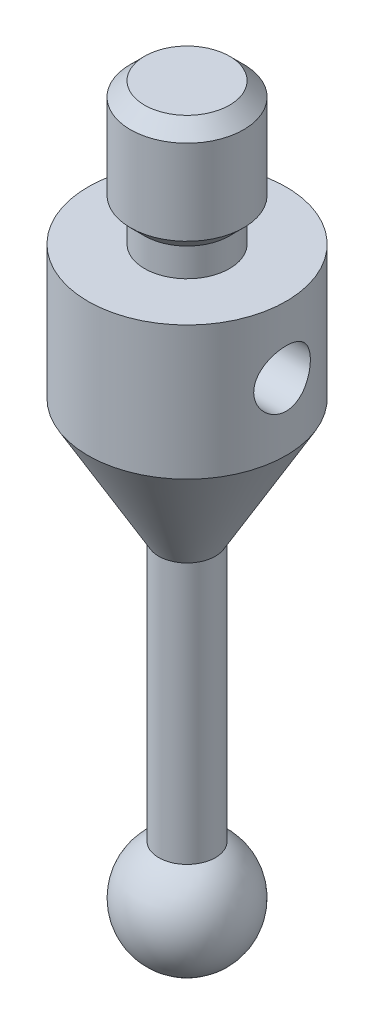
ISO-10303-21;
HEADER;
FILE_DESCRIPTION(('STEP AP214'),'2;1');
FILE_NAME('part.step','',(''),(''),'','','');
FILE_SCHEMA(('AUTOMOTIVE_DESIGN { 1 0 10303 214 1 1 1 1 }'));
ENDSEC;
DATA;
#1=APPLICATION_CONTEXT('core data for automotive mechanical design processes');
#2=APPLICATION_PROTOCOL_DEFINITION('international standard','automotive_design',2000,#1);
#3=PRODUCT_CONTEXT('',#1,'mechanical');
#4=PRODUCT('Part','Part','',(#3));
#5=PRODUCT_RELATED_PRODUCT_CATEGORY('part','',(#4));
#6=PRODUCT_DEFINITION_FORMATION('','',#4);
#7=PRODUCT_DEFINITION_CONTEXT('part definition',#1,'design');
#8=PRODUCT_DEFINITION('design','',#6,#7);
#9=PRODUCT_DEFINITION_SHAPE('','',#8);
#10=(LENGTH_UNIT() NAMED_UNIT(*) SI_UNIT(.MILLI.,.METRE.));
#11=(NAMED_UNIT(*) PLANE_ANGLE_UNIT() SI_UNIT($,.RADIAN.));
#12=(NAMED_UNIT(*) SI_UNIT($,.STERADIAN.) SOLID_ANGLE_UNIT());
#13=UNCERTAINTY_MEASURE_WITH_UNIT(LENGTH_MEASURE(1.E-05),#10,'distance_accuracy_value','');
#14=(GEOMETRIC_REPRESENTATION_CONTEXT(3) GLOBAL_UNCERTAINTY_ASSIGNED_CONTEXT((#13)) GLOBAL_UNIT_ASSIGNED_CONTEXT((#10,
#11,#12)) REPRESENTATION_CONTEXT('',''));
#15=CARTESIAN_POINT('',(0.,0.,0.));
#16=DIRECTION('',(0.,0.,1.));
#17=DIRECTION('',(1.,0.,0.));
#18=AXIS2_PLACEMENT_3D('',#15,#16,#17);
#19=CARTESIAN_POINT('',(0.,10.,0.));
#20=DIRECTION('',(0.,-1.,0.));
#21=DIRECTION('',(0.,0.,-1.));
#22=AXIS2_PLACEMENT_3D('',#19,#20,#21);
#23=CYLINDRICAL_SURFACE('',#22,1.);
#24=CARTESIAN_POINT('',(0.,10.952627944163,0.));
#25=DIRECTION('',(0.,1.,0.));
#26=DIRECTION('',(0.,0.,1.));
#27=AXIS2_PLACEMENT_3D('',#24,#25,#26);
#28=CIRCLE('',#27,1.);
#29=CARTESIAN_POINT('',(0.,10.952627944163,0.999999999999999));
#30=VERTEX_POINT('',#29);
#31=EDGE_CURVE('E151',#30,#30,#28,.F.);
#32=ORIENTED_EDGE('',*,*,#31,.T.);
#33=EDGE_LOOP('',(#32));
#34=FACE_BOUND('',#33,.T.);
#35=CARTESIAN_POINT('',(0.,1.73205080756888,0.));
#36=DIRECTION('',(0.,-1.,0.));
#37=DIRECTION('',(0.,0.,-1.));
#38=AXIS2_PLACEMENT_3D('',#35,#36,#37);
#39=CIRCLE('',#38,1.);
#40=CARTESIAN_POINT('',(0.,1.73205080756888,-1.));
#41=VERTEX_POINT('',#40);
#42=EDGE_CURVE('E146',#41,#41,#39,.T.);
#43=ORIENTED_EDGE('',*,*,#42,.F.);
#44=EDGE_LOOP('',(#43));
#45=FACE_BOUND('',#44,.T.);
#46=ADVANCED_FACE('F39',(#34,#45),#23,.T.);
#47=CARTESIAN_POINT('',(0.,0.,0.));
#48=DIRECTION('',(0.,-1.,0.));
#49=DIRECTION('',(1.,0.,0.));
#50=AXIS2_PLACEMENT_3D('',#47,#48,#49);
#51=SPHERICAL_SURFACE('',#50,2.);
#52=ORIENTED_EDGE('',*,*,#42,.T.);
#53=EDGE_LOOP('',(#52));
#54=FACE_BOUND('',#53,.T.);
#55=ADVANCED_FACE('F93',(#54),#51,.T.);
#56=CARTESIAN_POINT('',(0.,20.,0.));
#57=DIRECTION('',(0.,-1.,0.));
#58=DIRECTION('',(0.,0.,-1.));
#59=AXIS2_PLACEMENT_3D('',#56,#57,#58);
#60=CYLINDRICAL_SURFACE('',#59,3.5);
#61=CARTESIAN_POINT('',(-3.5,16.6413774815425,0.));
#62=CARTESIAN_POINT('',(-3.49999934647171,16.6413784513235,-0.0549774511886255));
#63=CARTESIAN_POINT('',(-3.49869208701023,16.6459263760306,-0.109964873936291));
#64=CARTESIAN_POINT('',(-3.49360452972549,16.6639596165937,-0.218345995598494));
#65=CARTESIAN_POINT('',(-3.48982329605034,16.6774483145796,-0.271739083414808));
#66=CARTESIAN_POINT('',(-3.48020345674544,16.7128815007508,-0.375352150368936));
#67=CARTESIAN_POINT('',(-3.474367720532,16.7348141996185,-0.425576440424113));
#68=CARTESIAN_POINT('',(-3.46124989158242,16.7864664772817,-0.521634380564634));
#69=CARTESIAN_POINT('',(-3.45396764753901,16.8161868707877,-0.567467570589078));
#70=CARTESIAN_POINT('',(-3.43852367312902,16.883394986879,-0.654647223429479));
#71=CARTESIAN_POINT('',(-3.4303452097302,16.9210498584703,-0.695861861190491));
#72=CARTESIAN_POINT('',(-3.41413367457396,17.0027013531112,-0.771485678962156));
#73=CARTESIAN_POINT('',(-3.40610062478085,17.0466989253581,-0.805893838538839));
#74=CARTESIAN_POINT('',(-3.39091507439313,17.1408742729386,-0.867598950032229));
#75=CARTESIAN_POINT('',(-3.38378351259108,17.1911584740771,-0.894739105517031));
#76=CARTESIAN_POINT('',(-3.37145671914235,17.2958134874158,-0.940125852769618));
#77=CARTESIAN_POINT('',(-3.36626107099664,17.3501834175701,-0.958374357777525));
#78=CARTESIAN_POINT('',(-3.35856804120241,17.4599948631266,-0.984992165068877));
#79=CARTESIAN_POINT('',(-3.35600489366891,17.5153731629416,-0.993602766016076));
#80=CARTESIAN_POINT('',(-3.35367104182518,17.6268430557842,-1.00145333894795));
#81=CARTESIAN_POINT('',(-3.35389973075333,17.6829344911757,-1.00069534704803));
#82=CARTESIAN_POINT('',(-3.35706517184156,17.7923117872693,-0.990020673813954));
#83=CARTESIAN_POINT('',(-3.35991391343389,17.8456296571326,-0.980401628641807));
#84=CARTESIAN_POINT('',(-3.36785674196985,17.9498610913567,-0.952756930429099));
#85=CARTESIAN_POINT('',(-3.37295103189705,18.0007744379029,-0.934730517406291));
#86=CARTESIAN_POINT('',(-3.38488431756517,18.0995006037583,-0.890553405689021));
#87=CARTESIAN_POINT('',(-3.39174458202416,18.1472660177433,-0.864302755864396));
#88=CARTESIAN_POINT('',(-3.40642608441438,18.2378157621493,-0.804491895839434));
#89=CARTESIAN_POINT('',(-3.41424753611068,18.28059898041,-0.770930058366727));
#90=CARTESIAN_POINT('',(-3.43033125328062,18.3616636693457,-0.695951998365102));
#91=CARTESIAN_POINT('',(-3.43859902286152,18.3997147195261,-0.654287437422663));
#92=CARTESIAN_POINT('',(-3.45438123609203,18.4683404833627,-0.565066141193114));
#93=CARTESIAN_POINT('',(-3.46189564068921,18.4989148095634,-0.517509100740947));
#94=CARTESIAN_POINT('',(-3.47538264032742,18.5518418489296,-0.417461536545724));
#95=CARTESIAN_POINT('',(-3.48134637748612,18.5741476249446,-0.364944908905003));
#96=CARTESIAN_POINT('',(-3.49099625743795,18.6095444272509,-0.256696614983735));
#97=CARTESIAN_POINT('',(-3.49468297428128,18.6226377761652,-0.200965762905073));
#98=CARTESIAN_POINT('',(-3.49927437257336,18.6388641243973,-0.0898331943221744));
#99=CARTESIAN_POINT('',(-3.50026636425301,18.642309829229,-0.0344806734302534));
#100=CARTESIAN_POINT('',(-3.49961042353544,18.640013848392,0.076013263402791));
#101=CARTESIAN_POINT('',(-3.49796280790308,18.6342732651196,0.131154703878552));
#102=CARTESIAN_POINT('',(-3.49226963342609,18.6140222593844,0.238509316715159));
#103=CARTESIAN_POINT('',(-3.48827306508862,18.5996908908808,0.290759105867427));
#104=CARTESIAN_POINT('',(-3.4783399937092,18.5628772305502,0.392104343102815));
#105=CARTESIAN_POINT('',(-3.47240326632854,18.5403939960979,0.441199425624337));
#106=CARTESIAN_POINT('',(-3.45904980584657,18.4873658132199,0.536020842560038));
#107=CARTESIAN_POINT('',(-3.45160381589487,18.4566568821296,0.581651243270128));
#108=CARTESIAN_POINT('',(-3.43608973548903,18.3882512285672,0.667219264029655));
#109=CARTESIAN_POINT('',(-3.42802150376367,18.3505529165111,0.707155585421215));
#110=CARTESIAN_POINT('',(-3.41184309815947,18.2677728105169,0.781553214170353));
#111=CARTESIAN_POINT('',(-3.40374018433795,18.2224898437597,0.815792713704769));
#112=CARTESIAN_POINT('',(-3.38869447362751,18.1266461872335,0.87619765803258));
#113=CARTESIAN_POINT('',(-3.3817516363796,18.0760856811693,0.902363383738854));
#114=CARTESIAN_POINT('',(-3.36989325638715,17.9713318760467,0.945687270594172));
#115=CARTESIAN_POINT('',(-3.36496700079018,17.9171595997562,0.962893166212217));
#116=CARTESIAN_POINT('',(-3.35771228398834,17.8065225137153,0.987897250353705));
#117=CARTESIAN_POINT('',(-3.35538303564047,17.7500584039915,0.995698289511612));
#118=CARTESIAN_POINT('',(-3.35365851547575,17.6387294650818,1.00149012123096));
#119=CARTESIAN_POINT('',(-3.35415580399703,17.5838847292662,0.999840138221142));
#120=CARTESIAN_POINT('',(-3.35777298607399,17.4752901162096,0.987623554788216));
#121=CARTESIAN_POINT('',(-3.36089279211716,17.421540202496,0.977057251899603));
#122=CARTESIAN_POINT('',(-3.36933488579116,17.3171882959588,0.947529844083143));
#123=CARTESIAN_POINT('',(-3.37463438524179,17.2665597880371,0.928655458931764));
#124=CARTESIAN_POINT('',(-3.38683651421364,17.1691481142963,0.883114746507969));
#125=CARTESIAN_POINT('',(-3.3937394274128,17.1223656309059,0.856447040215779));
#126=CARTESIAN_POINT('',(-3.40865834474881,17.0322857206399,0.795032732674125));
#127=CARTESIAN_POINT('',(-3.41670381589509,16.9891567858716,0.760046138613655));
#128=CARTESIAN_POINT('',(-3.43284922546139,16.9092655336376,0.683429920189677));
#129=CARTESIAN_POINT('',(-3.4409491770859,16.8725048219871,0.64179862536428));
#130=CARTESIAN_POINT('',(-3.45653979786176,16.8054588893792,0.551787160432696));
#131=CARTESIAN_POINT('',(-3.46400950518705,16.7753639879077,0.50326125117989));
#132=CARTESIAN_POINT('',(-3.47725697888987,16.7238045890315,0.401625264823331));
#133=CARTESIAN_POINT('',(-3.48303566935144,16.702335375576,0.34851771205737));
#134=CARTESIAN_POINT('',(-3.49163672362653,16.6709537058448,0.246458157667517));
#135=CARTESIAN_POINT('',(-3.49474842181038,16.6598907132003,0.197881503812195));
#136=CARTESIAN_POINT('',(-3.49893021926074,16.6451026529215,0.0995391843931838));
#137=CARTESIAN_POINT('',(-3.50000059166997,16.6413766035541,0.049773678808046));
#138=CARTESIAN_POINT('',(-3.5,16.6413774815425,0.));
#139=B_SPLINE_CURVE_WITH_KNOTS('',3,(#61,#62,#63,#64,#65,#66,#67,#68,#69,#70,#71,#72,#73,#74,
#75,#76,#77,#78,#79,#80,#81,#82,#83,#84,#85,#86,#87,#88,#89,#90,#91,#92,#93,#94,#95,#96,#97,#98,
#99,#100,#101,#102,#103,#104,#105,#106,#107,#108,#109,#110,#111,#112,#113,#114,#115,#116,#117,
#118,#119,#120,#121,#122,#123,#124,#125,#126,#127,#128,#129,#130,#131,#132,#133,#134,#135,#136,
#137,#138),.UNSPECIFIED.,.T.,.F.,(4,2,2,2,2,2,2,2,2,2,2,2,2,2,2,2,2,2,2,2,2,2,2,2,2,2,2,2,2,2,2,
2,2,2,2,2,2,2,4),(0.,0.164749656271172,0.32956166989759,0.494144406447671,0.65874436771758,
0.827239057653908,0.995758989368569,1.16766537650029,1.33953475772405,1.50699754929408,
1.67442394611628,1.83642392910678,1.99843855889074,2.16250401641616,2.32660602784683,
2.49689250297262,2.66718780073736,2.83843550548236,3.00964002003318,3.17522728845112,
3.34079468713336,3.50302570235771,3.66527548283776,3.83103762668237,3.99683751589905,
4.16806052438178,4.33927757478661,4.50957286677749,4.6798165288708,4.8436334080145,
5.00744482086203,5.16958548138846,5.33175484992002,5.49933828438395,5.6669639154745,
5.83888989478295,6.01072174610257,6.15989734012186,6.30905297207072),.UNSPECIFIED.);
#140=CARTESIAN_POINT('',(-3.5,16.6413774815425,0.));
#141=VERTEX_POINT('',#140);
#142=EDGE_CURVE('E58',#141,#141,#139,.T.);
#143=ORIENTED_EDGE('',*,*,#142,.T.);
#144=EDGE_LOOP('',(#143));
#145=FACE_BOUND('',#144,.T.);
#146=CARTESIAN_POINT('',(3.35410196624968,17.6413774815425,-1.));
#147=CARTESIAN_POINT('',(3.3541027352982,17.5864517126198,-0.999999010234619));
#148=CARTESIAN_POINT('',(3.35546589937234,17.5315159394628,-0.995459333009394));
#149=CARTESIAN_POINT('',(3.36075194701915,17.423241862155,-0.977461816962149));
#150=CARTESIAN_POINT('',(3.36467587174621,17.369904217001,-0.9640003506833));
#151=CARTESIAN_POINT('',(3.37460354734501,17.2664088810913,-0.928646716460411));
#152=CARTESIAN_POINT('',(3.38060407621639,17.2162464056298,-0.90676760325832));
#153=CARTESIAN_POINT('',(3.39400460555119,17.1202935757695,-0.855241820315742));
#154=CARTESIAN_POINT('',(3.40140477214508,17.0745037413546,-0.825594228332021));
#155=CARTESIAN_POINT('',(3.41700891605117,16.987281698884,-0.758462400490704));
#156=CARTESIAN_POINT('',(3.42522877981549,16.9459935804776,-0.720794605566171));
#157=CARTESIAN_POINT('',(3.44140982756535,16.8702260898909,-0.639085622734715));
#158=CARTESIAN_POINT('',(3.44937098116968,16.8357475149812,-0.595043689579839));
#159=CARTESIAN_POINT('',(3.46431666000611,16.7739631573657,-0.500823016078775));
#160=CARTESIAN_POINT('',(3.47128027250394,16.746802671667,-0.450545391880929));
#161=CARTESIAN_POINT('',(3.48326270242804,16.7013765943346,-0.345904237619826));
#162=CARTESIAN_POINT('',(3.48828189845443,16.6831092709224,-0.291541505437589));
#163=CARTESIAN_POINT('',(3.49569759650108,16.6564602509227,-0.181779287560588));
#164=CARTESIAN_POINT('',(3.49815913505649,16.6478329706902,-0.126443899064521));
#165=CARTESIAN_POINT('',(3.50041047829849,16.6399341146009,-0.0150600512109629));
#166=CARTESIAN_POINT('',(3.50020079369491,16.6406607503739,0.0409882697942736));
#167=CARTESIAN_POINT('',(3.49718003381653,16.6512806690015,0.15049009786761));
#168=CARTESIAN_POINT('',(3.49444435388027,16.6609082878615,0.203971773054472));
#169=CARTESIAN_POINT('',(3.48676943165067,16.6886250327747,0.308526111088808));
#170=CARTESIAN_POINT('',(3.48183005528105,16.7067146736736,0.359598627150254));
#171=CARTESIAN_POINT('',(3.47019515886062,16.7510321819484,0.458536916864462));
#172=CARTESIAN_POINT('',(3.46348102756093,16.7773468704467,0.506361521925387));
#173=CARTESIAN_POINT('',(3.44901384486994,16.8372997747415,0.597003621795242));
#174=CARTESIAN_POINT('',(3.44126056595877,16.8709395953758,0.639820016208004));
#175=CARTESIAN_POINT('',(3.42522841509913,16.9459803368518,0.720816324273877));
#176=CARTESIAN_POINT('',(3.41694064685079,16.9876121983451,0.758780788792453));
#177=CARTESIAN_POINT('',(3.4010148689311,17.0767350274655,0.827246507874877));
#178=CARTESIAN_POINT('',(3.39337691201241,17.1242264700169,0.857747156891287));
#179=CARTESIAN_POINT('',(3.37957587408658,17.2242429237916,0.910616679927255));
#180=CARTESIAN_POINT('',(3.37342505474766,17.2768050940688,0.932918688943925));
#181=CARTESIAN_POINT('',(3.36344272188227,17.3851540632944,0.968294757480381));
#182=CARTESIAN_POINT('',(3.35961053356452,17.4409399188709,0.981371502013291));
#183=CARTESIAN_POINT('',(3.35484557617748,17.5521176937044,0.997537085998827));
#184=CARTESIAN_POINT('',(3.35381855730447,17.607458390003,1.00095074078696));
#185=CARTESIAN_POINT('',(3.35452079870229,17.7179216395,0.998594983598455));
#186=CARTESIAN_POINT('',(3.35624971515342,17.7730442190498,0.992826717122485));
#187=CARTESIAN_POINT('',(3.36217715008271,17.8801980955578,0.972558907129289));
#188=CARTESIAN_POINT('',(3.3663182147774,17.9322712745511,0.958262310920607));
#189=CARTESIAN_POINT('',(3.37654531970352,18.0332784175404,0.921575809332241));
#190=CARTESIAN_POINT('',(3.38263164056921,18.0822119273651,0.899184736133867));
#191=CARTESIAN_POINT('',(3.3962509400331,18.1768885191512,0.846309825608092));
#192=CARTESIAN_POINT('',(3.40381598690189,18.2225227036437,0.815639458645651));
#193=CARTESIAN_POINT('',(3.41946863275287,18.3081156682641,0.747302318424216));
#194=CARTESIAN_POINT('',(3.42755634473907,18.3480732150486,0.709634028840688));
#195=CARTESIAN_POINT('',(3.44367363717939,18.4225671906866,0.626854004982778));
#196=CARTESIAN_POINT('',(3.45169203023043,18.4568749672519,0.581533855120275));
#197=CARTESIAN_POINT('',(3.46648988523027,18.5174003222339,0.485592653528774));
#198=CARTESIAN_POINT('',(3.47326941192714,18.5436183235037,0.434971879049092));
#199=CARTESIAN_POINT('',(3.48478252423195,18.5869696250557,0.330216636478082));
#200=CARTESIAN_POINT('',(3.48953154063622,18.6041716763356,0.276112399949817));
#201=CARTESIAN_POINT('',(3.49651669811944,18.6291908825126,0.165622824274961));
#202=CARTESIAN_POINT('',(3.4987534856151,18.6370104516332,0.109238075792719));
#203=CARTESIAN_POINT('',(3.50042667501642,18.6428731985414,-0.00208911897951403));
#204=CARTESIAN_POINT('',(3.49995851794498,18.6412495560839,-0.0570128155249779));
#205=CARTESIAN_POINT('',(3.49649534561067,18.6290583408374,-0.165772586211002));
#206=CARTESIAN_POINT('',(3.49350045135296,18.6184911963515,-0.219608712308766));
#207=CARTESIAN_POINT('',(3.48534400930059,18.5889118010531,-0.324202066519794));
#208=CARTESIAN_POINT('',(3.4802020702409,18.5699758920705,-0.374982516717526));
#209=CARTESIAN_POINT('',(3.46828547071724,18.5242644023998,-0.472673601380731));
#210=CARTESIAN_POINT('',(3.46151055750883,18.4974876079964,-0.519583635290341));
#211=CARTESIAN_POINT('',(3.44679477720104,18.4359288128301,-0.609716728176957));
#212=CARTESIAN_POINT('',(3.43882522893152,18.4009324381483,-0.65278866400354));
#213=CARTESIAN_POINT('',(3.42272032493228,18.3243229188156,-0.73256061115919));
#214=CARTESIAN_POINT('',(3.4145849239342,18.2827079460001,-0.769258856094888));
#215=CARTESIAN_POINT('',(3.39882018772077,18.1927290230449,-0.836204230145643));
#216=CARTESIAN_POINT('',(3.39120975884781,18.144216507791,-0.866256583618026));
#217=CARTESIAN_POINT('',(3.37764222665283,18.042616548885,-0.91773971809804));
#218=CARTESIAN_POINT('',(3.37168419857914,17.9895316859977,-0.93917532442409));
#219=CARTESIAN_POINT('',(3.36279229780033,17.8875506314268,-0.970492670062522));
#220=CARTESIAN_POINT('',(3.3595621942308,17.8390323074933,-0.981529499909266));
#221=CARTESIAN_POINT('',(3.35521684727178,17.7408044223646,-0.99628303521783));
#222=CARTESIAN_POINT('',(3.35410127012429,17.6910950504195,-1.00000089591333));
#223=CARTESIAN_POINT('',(3.35410196624968,17.6413774815425,-1.));
#224=B_SPLINE_CURVE_WITH_KNOTS('',3,(#146,#147,#148,#149,#150,#151,#152,#153,#154,#155,#156,
#157,#158,#159,#160,#161,#162,#163,#164,#165,#166,#167,#168,#169,#170,#171,#172,#173,#174,#175,
#176,#177,#178,#179,#180,#181,#182,#183,#184,#185,#186,#187,#188,#189,#190,#191,#192,#193,#194,
#195,#196,#197,#198,#199,#200,#201,#202,#203,#204,#205,#206,#207,#208,#209,#210,#211,#212,#213,
#214,#215,#216,#217,#218,#219,#220,#221,#222,#223),.UNSPECIFIED.,.T.,.F.,(4,2,2,2,2,2,2,2,2,2,2,
2,2,2,2,2,2,2,2,2,2,2,2,2,2,2,2,2,2,2,2,2,2,2,2,2,2,2,4),(0.,0.164594171159105,0.32925530476515,
0.493662091823938,0.65808840545939,0.826785835988799,0.995503006148135,1.16735741502495,
1.33917834504425,1.50651450509943,1.67381867271781,1.83628518817283,1.99876158968833,
2.16301451684818,2.3273034658799,2.49735806342072,2.66742645310452,2.83885260310575,
3.01022883892078,3.17577181660546,3.34129414341279,3.5030264482031,3.66478209600074,
3.83054003013244,3.99633392302106,4.16772694180382,4.33911100034378,4.50916842641099,
4.67918208530373,4.84323448834084,5.00727903537341,5.16985706186659,5.33246026763666,
5.4998988436474,5.66738374949711,5.83926806202707,6.01105598599879,6.16006644425301,
6.30905338065555),.UNSPECIFIED.);
#225=CARTESIAN_POINT('',(3.35410196624968,17.6413774815425,-1.));
#226=VERTEX_POINT('',#225);
#227=EDGE_CURVE('E66',#226,#226,#224,.T.);
#228=ORIENTED_EDGE('',*,*,#227,.T.);
#229=EDGE_LOOP('',(#228));
#230=FACE_BOUND('',#229,.T.);
#231=CARTESIAN_POINT('',(0.,15.2827549630852,0.));
#232=DIRECTION('',(0.,1.,0.));
#233=DIRECTION('',(0.,0.,1.));
#234=AXIS2_PLACEMENT_3D('',#231,#232,#233);
#235=CIRCLE('',#234,3.5);
#236=CARTESIAN_POINT('',(0.,15.2827549630852,3.5));
#237=VERTEX_POINT('',#236);
#238=EDGE_CURVE('E149',#237,#237,#235,.T.);
#239=ORIENTED_EDGE('',*,*,#238,.T.);
#240=EDGE_LOOP('',(#239));
#241=FACE_BOUND('',#240,.T.);
#242=CARTESIAN_POINT('',(0.,20.,0.));
#243=DIRECTION('',(0.,1.,0.));
#244=DIRECTION('',(0.,0.,1.));
#245=AXIS2_PLACEMENT_3D('',#242,#243,#244);
#246=CIRCLE('',#245,3.5);
#247=CARTESIAN_POINT('',(0.,20.,3.5));
#248=VERTEX_POINT('',#247);
#249=EDGE_CURVE('E143',#248,#248,#246,.T.);
#250=ORIENTED_EDGE('',*,*,#249,.F.);
#251=EDGE_LOOP('',(#250));
#252=FACE_BOUND('',#251,.T.);
#253=ADVANCED_FACE('F71',(#145,#230,#241,#252),#60,.T.);
#254=CARTESIAN_POINT('',(0.,20.,0.));
#255=DIRECTION('',(0.,1.,0.));
#256=DIRECTION('',(0.,0.,1.));
#257=AXIS2_PLACEMENT_3D('',#254,#255,#256);
#258=PLANE('',#257);
#259=CARTESIAN_POINT('',(0.,20.,0.));
#260=DIRECTION('',(0.,1.,0.));
#261=DIRECTION('',(0.,0.,1.));
#262=AXIS2_PLACEMENT_3D('',#259,#260,#261);
#263=CIRCLE('',#262,1.5);
#264=CARTESIAN_POINT('',(0.,20.,1.5));
#265=VERTEX_POINT('',#264);
#266=EDGE_CURVE('E55',#265,#265,#263,.T.);
#267=ORIENTED_EDGE('',*,*,#266,.F.);
#268=EDGE_LOOP('',(#267));
#269=FACE_BOUND('',#268,.T.);
#270=ORIENTED_EDGE('',*,*,#249,.T.);
#271=EDGE_LOOP('',(#270));
#272=FACE_BOUND('',#271,.T.);
#273=ADVANCED_FACE('F83',(#269,#272),#258,.T.);
#274=CARTESIAN_POINT('',(0.,15.2827549630852,0.));
#275=DIRECTION('',(0.,1.,0.));
#276=DIRECTION('',(0.,0.,1.));
#277=AXIS2_PLACEMENT_3D('',#274,#275,#276);
#278=CONICAL_SURFACE('',#277,3.5,0.523598775598295);
#279=CARTESIAN_POINT('',(0.,10.952627944163,0.999999999999999));
#280=CARTESIAN_POINT('',(0.,10.9977334339434,1.02604166666667));
#281=CARTESIAN_POINT('',(0.,11.0428389237238,1.05208333333333));
#282=CARTESIAN_POINT('',(0.,11.1330499032847,1.10416666666667));
#283=CARTESIAN_POINT('',(0.,11.1781553930652,1.13020833333333));
#284=CARTESIAN_POINT('',(0.,11.268366372626,1.18229166666667));
#285=CARTESIAN_POINT('',(0.,11.3134718624065,1.20833333333333));
#286=CARTESIAN_POINT('',(0.,11.4036828419674,1.26041666666667));
#287=CARTESIAN_POINT('',(0.,11.4487883317478,1.28645833333333));
#288=CARTESIAN_POINT('',(0.,11.5389993113087,1.33854166666667));
#289=CARTESIAN_POINT('',(0.,11.5841048010891,1.36458333333333));
#290=CARTESIAN_POINT('',(0.,11.67431578065,1.41666666666667));
#291=CARTESIAN_POINT('',(0.,11.7194212704304,1.44270833333333));
#292=CARTESIAN_POINT('',(0.,11.8096322499913,1.49479166666667));
#293=CARTESIAN_POINT('',(0.,11.8547377397718,1.52083333333333));
#294=CARTESIAN_POINT('',(0.,11.9449487193326,1.57291666666667));
#295=CARTESIAN_POINT('',(0.,11.9900542091131,1.59895833333333));
#296=CARTESIAN_POINT('',(0.,12.080265188674,1.65104166666667));
#297=CARTESIAN_POINT('',(0.,12.1253706784544,1.67708333333333));
#298=CARTESIAN_POINT('',(0.,12.2155816580153,1.72916666666667));
#299=CARTESIAN_POINT('',(0.,12.2606871477957,1.75520833333333));
#300=CARTESIAN_POINT('',(0.,12.3508981273566,1.80729166666667));
#301=CARTESIAN_POINT('',(0.,12.396003617137,1.83333333333333));
#302=CARTESIAN_POINT('',(0.,12.4862145966979,1.88541666666667));
#303=CARTESIAN_POINT('',(0.,12.5313200864784,1.91145833333333));
#304=CARTESIAN_POINT('',(0.,12.6215310660392,1.96354166666667));
#305=CARTESIAN_POINT('',(0.,12.6666365558197,1.98958333333333));
#306=CARTESIAN_POINT('',(0.,12.7568475353806,2.04166666666667));
#307=CARTESIAN_POINT('',(0.,12.801953025161,2.06770833333333));
#308=CARTESIAN_POINT('',(0.,12.8921640047219,2.11979166666667));
#309=CARTESIAN_POINT('',(0.,12.9372694945023,2.14583333333333));
#310=CARTESIAN_POINT('',(0.,13.0274804740632,2.19791666666667));
#311=CARTESIAN_POINT('',(0.,13.0725859638436,2.22395833333333));
#312=CARTESIAN_POINT('',(0.,13.1627969434045,2.27604166666667));
#313=CARTESIAN_POINT('',(0.,13.2079024331849,2.30208333333333));
#314=CARTESIAN_POINT('',(0.,13.2981134127458,2.35416666666667));
#315=CARTESIAN_POINT('',(0.,13.3432189025263,2.38020833333333));
#316=CARTESIAN_POINT('',(0.,13.4334298820872,2.43229166666667));
#317=CARTESIAN_POINT('',(0.,13.4785353718676,2.45833333333333));
#318=CARTESIAN_POINT('',(0.,13.5687463514285,2.51041666666667));
#319=CARTESIAN_POINT('',(0.,13.6138518412089,2.53645833333333));
#320=CARTESIAN_POINT('',(0.,13.7040628207698,2.58854166666667));
#321=CARTESIAN_POINT('',(0.,13.7491683105502,2.61458333333333));
#322=CARTESIAN_POINT('',(0.,13.8393792901111,2.66666666666667));
#323=CARTESIAN_POINT('',(0.,13.8844847798915,2.69270833333333));
#324=CARTESIAN_POINT('',(0.,13.9746957594524,2.74479166666667));
#325=CARTESIAN_POINT('',(0.,14.0198012492329,2.77083333333333));
#326=CARTESIAN_POINT('',(0.,14.1100122287937,2.82291666666667));
#327=CARTESIAN_POINT('',(0.,14.1551177185742,2.84895833333333));
#328=CARTESIAN_POINT('',(0.,14.2453286981351,2.90104166666667));
#329=CARTESIAN_POINT('',(0.,14.2904341879155,2.92708333333333));
#330=CARTESIAN_POINT('',(0.,14.3806451674764,2.97916666666667));
#331=CARTESIAN_POINT('',(0.,14.4257506572568,3.00520833333333));
#332=CARTESIAN_POINT('',(0.,14.5159616368177,3.05729166666667));
#333=CARTESIAN_POINT('',(0.,14.5610671265981,3.08333333333333));
#334=CARTESIAN_POINT('',(0.,14.651278106159,3.13541666666667));
#335=CARTESIAN_POINT('',(0.,14.6963835959395,3.16145833333333));
#336=CARTESIAN_POINT('',(0.,14.7865945755003,3.21354166666667));
#337=CARTESIAN_POINT('',(0.,14.8317000652808,3.23958333333333));
#338=CARTESIAN_POINT('',(0.,14.9219110448417,3.29166666666667));
#339=CARTESIAN_POINT('',(0.,14.9670165346221,3.31770833333333));
#340=CARTESIAN_POINT('',(0.,15.057227514183,3.36979166666667));
#341=CARTESIAN_POINT('',(0.,15.1023330039634,3.39583333333333));
#342=CARTESIAN_POINT('',(0.,15.1925439835243,3.44791666666667));
#343=CARTESIAN_POINT('',(0.,15.2376494733047,3.47395833333333));
#344=CARTESIAN_POINT('',(0.,15.2827549630852,3.5));
#345=B_SPLINE_CURVE_WITH_KNOTS('',3,(#279,#280,#281,#282,#283,#284,#285,#286,#287,#288,#289,
#290,#291,#292,#293,#294,#295,#296,#297,#298,#299,#300,#301,#302,#303,#304,#305,#306,#307,#308,
#309,#310,#311,#312,#313,#314,#315,#316,#317,#318,#319,#320,#321,#322,#323,#324,#325,#326,#327,
#328,#329,#330,#331,#332,#333,#334,#335,#336,#337,#338,#339,#340,#341,#342,#343,#344),
.UNSPECIFIED.,.F.,.F.,(4,2,2,2,2,2,2,2,2,2,2,2,2,2,2,2,2,2,2,2,2,2,2,2,2,2,2,2,2,2,2,2,4),(0.,
0.156250000000002,0.312500000000002,0.468750000000003,0.625000000000004,0.781250000000006,
0.937500000000006,1.09375000000001,1.25000000000001,1.40625000000001,1.56250000000001,
1.71875000000001,1.87500000000001,2.03125000000002,2.18750000000002,2.34375000000002,
2.50000000000002,2.65625000000002,2.81250000000002,2.96875000000002,3.12500000000002,
3.28125000000002,3.43750000000003,3.59375000000003,3.75000000000003,3.90625000000003,
4.06250000000003,4.21875000000003,4.37500000000003,4.53125000000003,4.68750000000004,
4.84375000000004,5.00000000000004),.UNSPECIFIED.);
#346=EDGE_CURVE('BSEAM80',#30,#237,#345,.T.);
#347=ORIENTED_EDGE('',*,*,#31,.F.);
#348=ORIENTED_EDGE('',*,*,#238,.F.);
#349=ORIENTED_EDGE('',*,*,#346,.T.);
#350=ORIENTED_EDGE('',*,*,#346,.F.);
#351=EDGE_LOOP('',(#347,#349,#348,#350));
#352=FACE_BOUND('',#351,.T.);
#353=ADVANCED_FACE('F80',(#352),#278,.T.);
#354=CARTESIAN_POINT('',(-3.5,17.6413774815425,0.));
#355=DIRECTION('',(1.,0.,0.));
#356=DIRECTION('',(0.,0.,-1.));
#357=AXIS2_PLACEMENT_3D('',#354,#355,#356);
#358=CYLINDRICAL_SURFACE('',#357,1.);
#359=ORIENTED_EDGE('',*,*,#227,.F.);
#360=EDGE_LOOP('',(#359));
#361=FACE_BOUND('',#360,.T.);
#362=ORIENTED_EDGE('',*,*,#142,.F.);
#363=EDGE_LOOP('',(#362));
#364=FACE_BOUND('',#363,.T.);
#365=ADVANCED_FACE('F75',(#361,#364),#358,.F.);
#366=CARTESIAN_POINT('',(0.,21.,0.));
#367=DIRECTION('',(0.,-1.,0.));
#368=DIRECTION('',(0.,0.,-1.));
#369=AXIS2_PLACEMENT_3D('',#366,#367,#368);
#370=CYLINDRICAL_SURFACE('',#369,1.5);
#371=CARTESIAN_POINT('',(0.,21.,0.));
#372=DIRECTION('',(0.,1.,0.));
#373=DIRECTION('',(0.,0.,1.));
#374=AXIS2_PLACEMENT_3D('',#371,#372,#373);
#375=CIRCLE('',#374,1.5);
#376=CARTESIAN_POINT('',(0.,21.,1.5));
#377=VERTEX_POINT('',#376);
#378=EDGE_CURVE('E138',#377,#377,#375,.T.);
#379=ORIENTED_EDGE('',*,*,#378,.F.);
#380=EDGE_LOOP('',(#379));
#381=FACE_BOUND('',#380,.T.);
#382=ORIENTED_EDGE('',*,*,#266,.T.);
#383=EDGE_LOOP('',(#382));
#384=FACE_BOUND('',#383,.T.);
#385=ADVANCED_FACE('F79',(#381,#384),#370,.T.);
#386=CARTESIAN_POINT('',(0.,25.,0.));
#387=DIRECTION('',(0.,-1.,0.));
#388=DIRECTION('',(0.,0.,-1.));
#389=AXIS2_PLACEMENT_3D('',#386,#387,#388);
#390=CYLINDRICAL_SURFACE('',#389,2.);
#391=CARTESIAN_POINT('',(0.,24.5,0.));
#392=DIRECTION('',(0.,1.,0.));
#393=DIRECTION('',(0.,0.,1.));
#394=AXIS2_PLACEMENT_3D('',#391,#392,#393);
#395=CIRCLE('',#394,2.);
#396=CARTESIAN_POINT('',(0.,24.5,2.));
#397=VERTEX_POINT('',#396);
#398=EDGE_CURVE('E10',#397,#397,#395,.F.);
#399=ORIENTED_EDGE('',*,*,#398,.T.);
#400=EDGE_LOOP('',(#399));
#401=FACE_BOUND('',#400,.T.);
#402=CARTESIAN_POINT('',(0.,21.5,0.));
#403=DIRECTION('',(0.,1.,0.));
#404=DIRECTION('',(0.,0.,1.));
#405=AXIS2_PLACEMENT_3D('',#402,#403,#404);
#406=CIRCLE('',#405,2.);
#407=CARTESIAN_POINT('',(0.,21.5,2.));
#408=VERTEX_POINT('',#407);
#409=EDGE_CURVE('E47',#408,#408,#406,.T.);
#410=ORIENTED_EDGE('',*,*,#409,.T.);
#411=EDGE_LOOP('',(#410));
#412=FACE_BOUND('',#411,.T.);
#413=ADVANCED_FACE('F121',(#401,#412),#390,.T.);
#414=CARTESIAN_POINT('',(0.,25.,0.));
#415=DIRECTION('',(0.,1.,0.));
#416=DIRECTION('',(0.,0.,1.));
#417=AXIS2_PLACEMENT_3D('',#414,#415,#416);
#418=PLANE('',#417);
#419=CARTESIAN_POINT('',(0.,25.,0.));
#420=DIRECTION('',(0.,1.,0.));
#421=DIRECTION('',(0.,0.,1.));
#422=AXIS2_PLACEMENT_3D('',#419,#420,#421);
#423=CIRCLE('',#422,1.49999999999999);
#424=CARTESIAN_POINT('',(0.,25.,1.49999999999999));
#425=VERTEX_POINT('',#424);
#426=EDGE_CURVE('E51',#425,#425,#423,.T.);
#427=ORIENTED_EDGE('',*,*,#426,.T.);
#428=EDGE_LOOP('',(#427));
#429=FACE_BOUND('',#428,.T.);
#430=ADVANCED_FACE('F114',(#429),#418,.T.);
#431=CARTESIAN_POINT('',(0.,25.,0.));
#432=DIRECTION('',(0.,-1.,0.));
#433=DIRECTION('',(0.,0.,-1.));
#434=AXIS2_PLACEMENT_3D('',#431,#432,#433);
#435=CONICAL_SURFACE('',#434,1.49999999999999,0.785398163397447);
#436=ORIENTED_EDGE('',*,*,#398,.F.);
#437=EDGE_LOOP('',(#436));
#438=FACE_BOUND('',#437,.T.);
#439=ORIENTED_EDGE('',*,*,#426,.F.);
#440=EDGE_LOOP('',(#439));
#441=FACE_BOUND('',#440,.T.);
#442=ADVANCED_FACE('F110',(#438,#441),#435,.T.);
#443=CARTESIAN_POINT('',(0.,21.5,0.));
#444=DIRECTION('',(0.,1.,0.));
#445=DIRECTION('',(0.,0.,1.));
#446=AXIS2_PLACEMENT_3D('',#443,#444,#445);
#447=CONICAL_SURFACE('',#446,2.,0.785398163397457);
#448=ORIENTED_EDGE('',*,*,#378,.T.);
#449=EDGE_LOOP('',(#448));
#450=FACE_BOUND('',#449,.T.);
#451=ORIENTED_EDGE('',*,*,#409,.F.);
#452=EDGE_LOOP('',(#451));
#453=FACE_BOUND('',#452,.T.);
#454=ADVANCED_FACE('F42',(#450,#453),#447,.T.);
#455=CLOSED_SHELL('',(#46,#55,#253,#273,#353,#365,#385,#413,#430,#442,#454));
#456=MANIFOLD_SOLID_BREP('B2',#455);
#457=ADVANCED_BREP_SHAPE_REPRESENTATION('',(#18,#456),#14);
#458=SHAPE_DEFINITION_REPRESENTATION(#9,#457);
ENDSEC;
END-ISO-10303-21;
